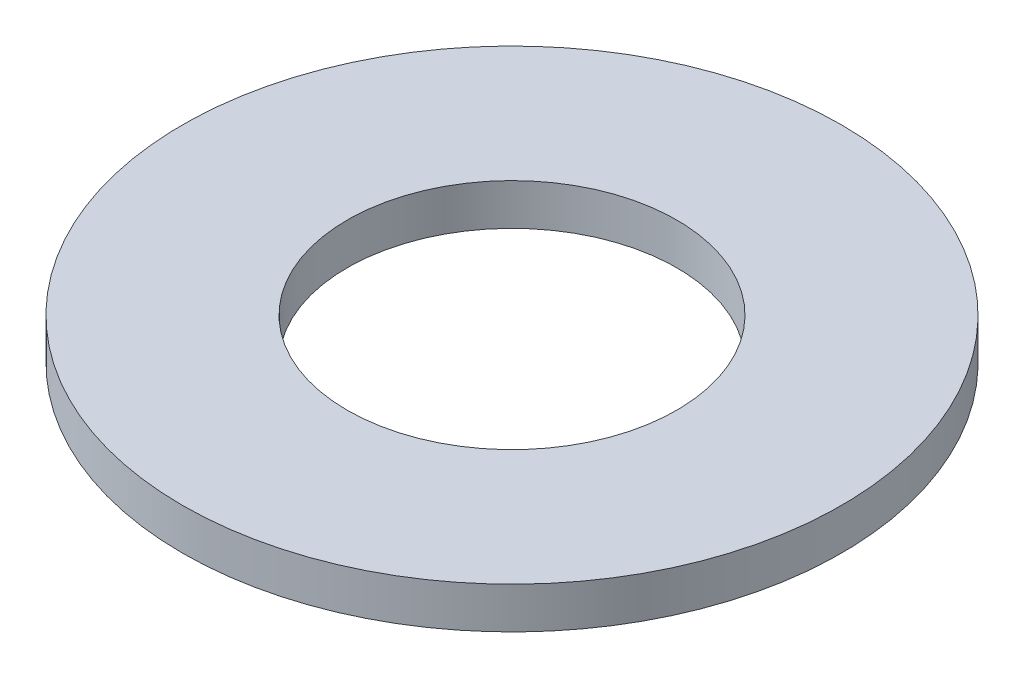
ISO-10303-21;
HEADER;
FILE_DESCRIPTION(('STEP AP214'),'2;1');
FILE_NAME('part.step','',(''),(''),'','','');
FILE_SCHEMA(('AUTOMOTIVE_DESIGN { 1 0 10303 214 1 1 1 1 }'));
ENDSEC;
DATA;
#1=APPLICATION_CONTEXT('core data for automotive mechanical design processes');
#2=APPLICATION_PROTOCOL_DEFINITION('international standard','automotive_design',2000,#1);
#3=PRODUCT_CONTEXT('',#1,'mechanical');
#4=PRODUCT('Part','Part','',(#3));
#5=PRODUCT_RELATED_PRODUCT_CATEGORY('part','',(#4));
#6=PRODUCT_DEFINITION_FORMATION('','',#4);
#7=PRODUCT_DEFINITION_CONTEXT('part definition',#1,'design');
#8=PRODUCT_DEFINITION('design','',#6,#7);
#9=PRODUCT_DEFINITION_SHAPE('','',#8);
#10=(LENGTH_UNIT() NAMED_UNIT(*) SI_UNIT(.MILLI.,.METRE.));
#11=(NAMED_UNIT(*) PLANE_ANGLE_UNIT() SI_UNIT($,.RADIAN.));
#12=(NAMED_UNIT(*) SI_UNIT($,.STERADIAN.) SOLID_ANGLE_UNIT());
#13=UNCERTAINTY_MEASURE_WITH_UNIT(LENGTH_MEASURE(1.E-05),#10,'distance_accuracy_value','');
#14=(GEOMETRIC_REPRESENTATION_CONTEXT(3) GLOBAL_UNCERTAINTY_ASSIGNED_CONTEXT((#13)) GLOBAL_UNIT_ASSIGNED_CONTEXT((#10,
#11,#12)) REPRESENTATION_CONTEXT('',''));
#15=CARTESIAN_POINT('',(0.,0.,0.));
#16=DIRECTION('',(0.,0.,1.));
#17=DIRECTION('',(1.,0.,0.));
#18=AXIS2_PLACEMENT_3D('',#15,#16,#17);
#19=CARTESIAN_POINT('',(0.,1.2954,0.));
#20=DIRECTION('',(0.,1.,0.));
#21=DIRECTION('',(0.,0.,1.));
#22=AXIS2_PLACEMENT_3D('',#19,#20,#21);
#23=PLANE('',#22);
#24=CARTESIAN_POINT('',(0.,1.2954,0.));
#25=DIRECTION('',(0.,1.,0.));
#26=DIRECTION('',(0.,0.,1.));
#27=AXIS2_PLACEMENT_3D('',#24,#25,#26);
#28=CIRCLE('',#27,10.31875);
#29=CARTESIAN_POINT('',(0.,1.2954,10.31875));
#30=VERTEX_POINT('',#29);
#31=EDGE_CURVE('E10',#30,#30,#28,.T.);
#32=ORIENTED_EDGE('',*,*,#31,.T.);
#33=EDGE_LOOP('',(#32));
#34=FACE_BOUND('',#33,.T.);
#35=CARTESIAN_POINT('',(0.,1.2954,0.));
#36=DIRECTION('',(0.,1.,0.));
#37=DIRECTION('',(0.,0.,1.));
#38=AXIS2_PLACEMENT_3D('',#35,#36,#37);
#39=CIRCLE('',#38,5.159375);
#40=CARTESIAN_POINT('',(0.,1.2954,5.159375));
#41=VERTEX_POINT('',#40);
#42=EDGE_CURVE('E41',#41,#41,#39,.T.);
#43=ORIENTED_EDGE('',*,*,#42,.F.);
#44=EDGE_LOOP('',(#43));
#45=FACE_BOUND('',#44,.T.);
#46=ADVANCED_FACE('F30',(#34,#45),#23,.T.);
#47=CARTESIAN_POINT('',(0.,0.,0.));
#48=DIRECTION('',(0.,1.,0.));
#49=DIRECTION('',(0.,0.,1.));
#50=AXIS2_PLACEMENT_3D('',#47,#48,#49);
#51=PLANE('',#50);
#52=CARTESIAN_POINT('',(0.,0.,0.));
#53=DIRECTION('',(0.,1.,0.));
#54=DIRECTION('',(0.,0.,1.));
#55=AXIS2_PLACEMENT_3D('',#52,#53,#54);
#56=CIRCLE('',#55,10.31875);
#57=CARTESIAN_POINT('',(0.,0.,10.31875));
#58=VERTEX_POINT('',#57);
#59=EDGE_CURVE('E34',#58,#58,#56,.T.);
#60=ORIENTED_EDGE('',*,*,#59,.F.);
#61=EDGE_LOOP('',(#60));
#62=FACE_BOUND('',#61,.T.);
#63=CARTESIAN_POINT('',(0.,0.,0.));
#64=DIRECTION('',(0.,1.,0.));
#65=DIRECTION('',(0.,0.,1.));
#66=AXIS2_PLACEMENT_3D('',#63,#64,#65);
#67=CIRCLE('',#66,5.159375);
#68=CARTESIAN_POINT('',(0.,0.,5.159375));
#69=VERTEX_POINT('',#68);
#70=EDGE_CURVE('E43',#69,#69,#67,.T.);
#71=ORIENTED_EDGE('',*,*,#70,.T.);
#72=EDGE_LOOP('',(#71));
#73=FACE_BOUND('',#72,.T.);
#74=ADVANCED_FACE('F53',(#62,#73),#51,.F.);
#75=CARTESIAN_POINT('',(0.,1.2954,0.));
#76=DIRECTION('',(0.,-1.,0.));
#77=DIRECTION('',(0.,0.,-1.));
#78=AXIS2_PLACEMENT_3D('',#75,#76,#77);
#79=CYLINDRICAL_SURFACE('',#78,10.31875);
#80=ORIENTED_EDGE('',*,*,#31,.F.);
#81=EDGE_LOOP('',(#80));
#82=FACE_BOUND('',#81,.T.);
#83=ORIENTED_EDGE('',*,*,#59,.T.);
#84=EDGE_LOOP('',(#83));
#85=FACE_BOUND('',#84,.T.);
#86=ADVANCED_FACE('F32',(#82,#85),#79,.T.);
#87=CARTESIAN_POINT('',(0.,1.2954,0.));
#88=DIRECTION('',(0.,-1.,0.));
#89=DIRECTION('',(0.,0.,-1.));
#90=AXIS2_PLACEMENT_3D('',#87,#88,#89);
#91=CYLINDRICAL_SURFACE('',#90,5.159375);
#92=ORIENTED_EDGE('',*,*,#42,.T.);
#93=EDGE_LOOP('',(#92));
#94=FACE_BOUND('',#93,.T.);
#95=ORIENTED_EDGE('',*,*,#70,.F.);
#96=EDGE_LOOP('',(#95));
#97=FACE_BOUND('',#96,.T.);
#98=ADVANCED_FACE('F49',(#94,#97),#91,.F.);
#99=CLOSED_SHELL('',(#46,#74,#86,#98));
#100=MANIFOLD_SOLID_BREP('B2',#99);
#101=ADVANCED_BREP_SHAPE_REPRESENTATION('',(#18,#100),#14);
#102=SHAPE_DEFINITION_REPRESENTATION(#9,#101);
ENDSEC;
END-ISO-10303-21;
